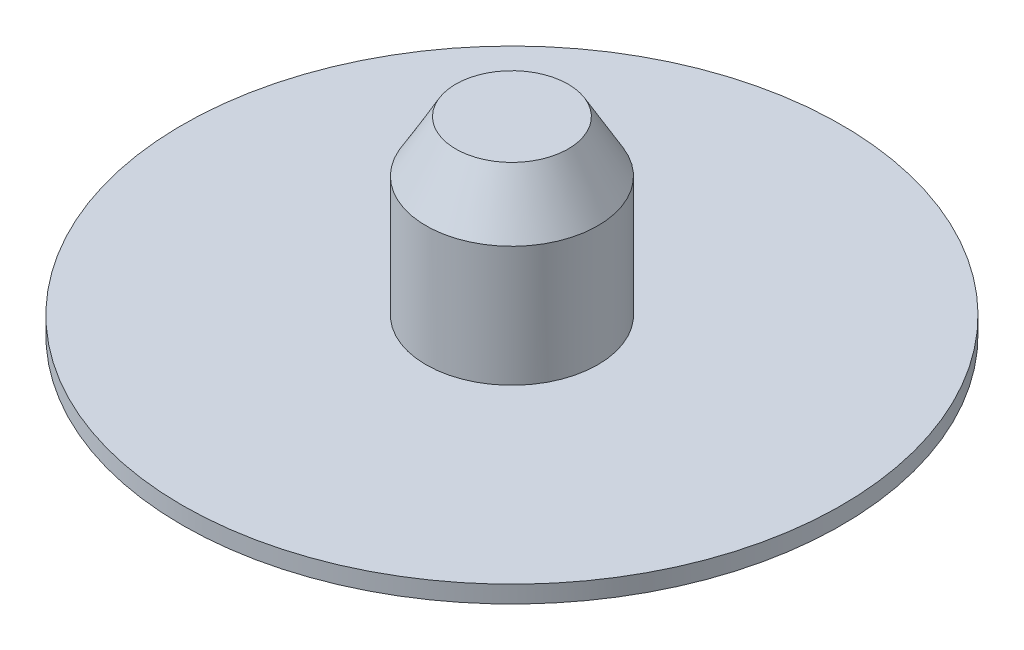
ISO-10303-21;
HEADER;
FILE_DESCRIPTION(('STEP AP214'),'2;1');
FILE_NAME('part.step','',(''),(''),'','','');
FILE_SCHEMA(('AUTOMOTIVE_DESIGN { 1 0 10303 214 1 1 1 1 }'));
ENDSEC;
DATA;
#1=APPLICATION_CONTEXT('core data for automotive mechanical design processes');
#2=APPLICATION_PROTOCOL_DEFINITION('international standard','automotive_design',2000,#1);
#3=PRODUCT_CONTEXT('',#1,'mechanical');
#4=PRODUCT('Part','Part','',(#3));
#5=PRODUCT_RELATED_PRODUCT_CATEGORY('part','',(#4));
#6=PRODUCT_DEFINITION_FORMATION('','',#4);
#7=PRODUCT_DEFINITION_CONTEXT('part definition',#1,'design');
#8=PRODUCT_DEFINITION('design','',#6,#7);
#9=PRODUCT_DEFINITION_SHAPE('','',#8);
#10=(LENGTH_UNIT() NAMED_UNIT(*) SI_UNIT(.MILLI.,.METRE.));
#11=(NAMED_UNIT(*) PLANE_ANGLE_UNIT() SI_UNIT($,.RADIAN.));
#12=(NAMED_UNIT(*) SI_UNIT($,.STERADIAN.) SOLID_ANGLE_UNIT());
#13=UNCERTAINTY_MEASURE_WITH_UNIT(LENGTH_MEASURE(1.E-05),#10,'distance_accuracy_value','');
#14=(GEOMETRIC_REPRESENTATION_CONTEXT(3) GLOBAL_UNCERTAINTY_ASSIGNED_CONTEXT((#13)) GLOBAL_UNIT_ASSIGNED_CONTEXT((#10,
#11,#12)) REPRESENTATION_CONTEXT('',''));
#15=CARTESIAN_POINT('',(0.,0.,0.));
#16=DIRECTION('',(0.,0.,1.));
#17=DIRECTION('',(1.,0.,0.));
#18=AXIS2_PLACEMENT_3D('',#15,#16,#17);
#19=CARTESIAN_POINT('',(0.,0.3,0.));
#20=DIRECTION('',(0.,-1.,0.));
#21=DIRECTION('',(0.,0.,-1.));
#22=AXIS2_PLACEMENT_3D('',#19,#20,#21);
#23=CYLINDRICAL_SURFACE('',#22,5.75);
#24=CARTESIAN_POINT('',(0.,0.3,0.));
#25=DIRECTION('',(0.,1.,0.));
#26=DIRECTION('',(0.,0.,1.));
#27=AXIS2_PLACEMENT_3D('',#24,#25,#26);
#28=CIRCLE('',#27,5.75);
#29=CARTESIAN_POINT('',(0.,0.3,5.75));
#30=VERTEX_POINT('',#29);
#31=EDGE_CURVE('E48',#30,#30,#28,.T.);
#32=ORIENTED_EDGE('',*,*,#31,.F.);
#33=EDGE_LOOP('',(#32));
#34=FACE_BOUND('',#33,.T.);
#35=CARTESIAN_POINT('',(0.,0.,0.));
#36=DIRECTION('',(0.,1.,0.));
#37=DIRECTION('',(0.,0.,1.));
#38=AXIS2_PLACEMENT_3D('',#35,#36,#37);
#39=CIRCLE('',#38,5.75);
#40=CARTESIAN_POINT('',(0.,0.,5.75));
#41=VERTEX_POINT('',#40);
#42=EDGE_CURVE('E51',#41,#41,#39,.T.);
#43=ORIENTED_EDGE('',*,*,#42,.T.);
#44=EDGE_LOOP('',(#43));
#45=FACE_BOUND('',#44,.T.);
#46=ADVANCED_FACE('F32',(#34,#45),#23,.T.);
#47=CARTESIAN_POINT('',(0.,0.3,0.));
#48=DIRECTION('',(0.,1.,0.));
#49=DIRECTION('',(0.,0.,1.));
#50=AXIS2_PLACEMENT_3D('',#47,#48,#49);
#51=PLANE('',#50);
#52=CARTESIAN_POINT('',(0.,0.3,0.));
#53=DIRECTION('',(0.,1.,0.));
#54=DIRECTION('',(0.,0.,1.));
#55=AXIS2_PLACEMENT_3D('',#52,#53,#54);
#56=CIRCLE('',#55,1.5);
#57=CARTESIAN_POINT('',(0.,0.3,1.5));
#58=VERTEX_POINT('',#57);
#59=EDGE_CURVE('E44',#58,#58,#56,.T.);
#60=ORIENTED_EDGE('',*,*,#59,.F.);
#61=EDGE_LOOP('',(#60));
#62=FACE_BOUND('',#61,.T.);
#63=ORIENTED_EDGE('',*,*,#31,.T.);
#64=EDGE_LOOP('',(#63));
#65=FACE_BOUND('',#64,.T.);
#66=ADVANCED_FACE('F57',(#62,#65),#51,.T.);
#67=CARTESIAN_POINT('',(0.,0.,0.));
#68=DIRECTION('',(0.,1.,0.));
#69=DIRECTION('',(0.,0.,1.));
#70=AXIS2_PLACEMENT_3D('',#67,#68,#69);
#71=PLANE('',#70);
#72=ORIENTED_EDGE('',*,*,#42,.F.);
#73=EDGE_LOOP('',(#72));
#74=FACE_BOUND('',#73,.T.);
#75=ADVANCED_FACE('F63',(#74),#71,.F.);
#76=CARTESIAN_POINT('',(0.,3.3,0.));
#77=DIRECTION('',(0.,-1.,0.));
#78=DIRECTION('',(0.,0.,-1.));
#79=AXIS2_PLACEMENT_3D('',#76,#77,#78);
#80=CYLINDRICAL_SURFACE('',#79,1.5);
#81=CARTESIAN_POINT('',(0.,2.39999999999999,0.));
#82=DIRECTION('',(0.,1.,0.));
#83=DIRECTION('',(0.,0.,1.));
#84=AXIS2_PLACEMENT_3D('',#81,#82,#83);
#85=CIRCLE('',#84,1.5);
#86=CARTESIAN_POINT('',(0.,2.39999999999999,-1.5));
#87=VERTEX_POINT('',#86);
#88=EDGE_CURVE('E10',#87,#87,#85,.F.);
#89=ORIENTED_EDGE('',*,*,#88,.T.);
#90=EDGE_LOOP('',(#89));
#91=FACE_BOUND('',#90,.T.);
#92=ORIENTED_EDGE('',*,*,#59,.T.);
#93=EDGE_LOOP('',(#92));
#94=FACE_BOUND('',#93,.T.);
#95=ADVANCED_FACE('F65',(#91,#94),#80,.T.);
#96=CARTESIAN_POINT('',(0.,3.3,0.));
#97=DIRECTION('',(0.,1.,0.));
#98=DIRECTION('',(0.,0.,1.));
#99=AXIS2_PLACEMENT_3D('',#96,#97,#98);
#100=PLANE('',#99);
#101=CARTESIAN_POINT('',(0.,3.3,0.));
#102=DIRECTION('',(0.,1.,0.));
#103=DIRECTION('',(0.,0.,1.));
#104=AXIS2_PLACEMENT_3D('',#101,#102,#103);
#105=CIRCLE('',#104,0.980384757729335);
#106=CARTESIAN_POINT('',(0.,3.3,-0.980384757729335));
#107=VERTEX_POINT('',#106);
#108=EDGE_CURVE('E40',#107,#107,#105,.T.);
#109=ORIENTED_EDGE('',*,*,#108,.T.);
#110=EDGE_LOOP('',(#109));
#111=FACE_BOUND('',#110,.T.);
#112=ADVANCED_FACE('F71',(#111),#100,.T.);
#113=CARTESIAN_POINT('',(0.,3.3,0.));
#114=DIRECTION('',(0.,-1.,0.));
#115=DIRECTION('',(0.,0.,-1.));
#116=AXIS2_PLACEMENT_3D('',#113,#114,#115);
#117=CONICAL_SURFACE('',#116,0.980384757729335,0.523598775598297);
#118=CARTESIAN_POINT('',(0.,2.39999999999999,-1.5));
#119=CARTESIAN_POINT('',(0.,2.40937499999999,-1.49458734122635));
#120=CARTESIAN_POINT('',(0.,2.41874999999999,-1.48917468245269));
#121=CARTESIAN_POINT('',(0.,2.43749999999999,-1.47834936490539));
#122=CARTESIAN_POINT('',(0.,2.44687499999999,-1.47293670613174));
#123=CARTESIAN_POINT('',(0.,2.46562499999999,-1.46211138858443));
#124=CARTESIAN_POINT('',(0.,2.47499999999999,-1.45669872981078));
#125=CARTESIAN_POINT('',(0.,2.49374999999999,-1.44587341226347));
#126=CARTESIAN_POINT('',(0.,2.50312499999999,-1.44046075348982));
#127=CARTESIAN_POINT('',(0.,2.52187499999999,-1.42963543594251));
#128=CARTESIAN_POINT('',(0.,2.53124999999999,-1.42422277716886));
#129=CARTESIAN_POINT('',(0.,2.54999999999999,-1.41339745962156));
#130=CARTESIAN_POINT('',(0.,2.55937499999999,-1.4079848008479));
#131=CARTESIAN_POINT('',(0.,2.57812499999999,-1.3971594833006));
#132=CARTESIAN_POINT('',(0.,2.58749999999999,-1.39174682452694));
#133=CARTESIAN_POINT('',(0.,2.60624999999999,-1.38092150697964));
#134=CARTESIAN_POINT('',(0.,2.61562499999999,-1.37550884820599));
#135=CARTESIAN_POINT('',(0.,2.63437499999999,-1.36468353065868));
#136=CARTESIAN_POINT('',(0.,2.64374999999999,-1.35927087188503));
#137=CARTESIAN_POINT('',(0.,2.66249999999999,-1.34844555433772));
#138=CARTESIAN_POINT('',(0.,2.671875,-1.34303289556407));
#139=CARTESIAN_POINT('',(0.,2.69062499999999,-1.33220757801676));
#140=CARTESIAN_POINT('',(0.,2.69999999999999,-1.32679491924311));
#141=CARTESIAN_POINT('',(0.,2.71875,-1.31596960169581));
#142=CARTESIAN_POINT('',(0.,2.728125,-1.31055694292215));
#143=CARTESIAN_POINT('',(0.,2.746875,-1.29973162537485));
#144=CARTESIAN_POINT('',(0.,2.75625,-1.2943189666012));
#145=CARTESIAN_POINT('',(0.,2.775,-1.28349364905389));
#146=CARTESIAN_POINT('',(0.,2.784375,-1.27808099028024));
#147=CARTESIAN_POINT('',(0.,2.803125,-1.26725567273293));
#148=CARTESIAN_POINT('',(0.,2.8125,-1.26184301395928));
#149=CARTESIAN_POINT('',(0.,2.83125,-1.25101769641197));
#150=CARTESIAN_POINT('',(0.,2.840625,-1.24560503763832));
#151=CARTESIAN_POINT('',(0.,2.859375,-1.23477972009101));
#152=CARTESIAN_POINT('',(0.,2.86875,-1.22936706131736));
#153=CARTESIAN_POINT('',(0.,2.8875,-1.21854174377006));
#154=CARTESIAN_POINT('',(0.,2.896875,-1.2131290849964));
#155=CARTESIAN_POINT('',(0.,2.915625,-1.2023037674491));
#156=CARTESIAN_POINT('',(0.,2.925,-1.19689110867545));
#157=CARTESIAN_POINT('',(0.,2.94375,-1.18606579112814));
#158=CARTESIAN_POINT('',(0.,2.953125,-1.18065313235449));
#159=CARTESIAN_POINT('',(0.,2.971875,-1.16982781480718));
#160=CARTESIAN_POINT('',(0.,2.98125,-1.16441515603353));
#161=CARTESIAN_POINT('',(0.,3.,-1.15358983848622));
#162=CARTESIAN_POINT('',(0.,3.009375,-1.14817717971257));
#163=CARTESIAN_POINT('',(0.,3.028125,-1.13735186216527));
#164=CARTESIAN_POINT('',(0.,3.0375,-1.13193920339161));
#165=CARTESIAN_POINT('',(0.,3.05625,-1.12111388584431));
#166=CARTESIAN_POINT('',(0.,3.065625,-1.11570122707065));
#167=CARTESIAN_POINT('',(0.,3.084375,-1.10487590952335));
#168=CARTESIAN_POINT('',(0.,3.09375,-1.0994632507497));
#169=CARTESIAN_POINT('',(0.,3.1125,-1.08863793320239));
#170=CARTESIAN_POINT('',(0.,3.121875,-1.08322527442874));
#171=CARTESIAN_POINT('',(0.,3.140625,-1.07239995688143));
#172=CARTESIAN_POINT('',(0.,3.15,-1.06698729810778));
#173=CARTESIAN_POINT('',(0.,3.16875,-1.05616198056047));
#174=CARTESIAN_POINT('',(0.,3.178125,-1.05074932178682));
#175=CARTESIAN_POINT('',(0.,3.196875,-1.03992400423952));
#176=CARTESIAN_POINT('',(0.,3.20625,-1.03451134546586));
#177=CARTESIAN_POINT('',(0.,3.225,-1.02368602791856));
#178=CARTESIAN_POINT('',(0.,3.234375,-1.0182733691449));
#179=CARTESIAN_POINT('',(0.,3.253125,-1.0074480515976));
#180=CARTESIAN_POINT('',(0.,3.2625,-1.00203539282395));
#181=CARTESIAN_POINT('',(0.,3.28125,-0.991210075276641));
#182=CARTESIAN_POINT('',(0.,3.290625,-0.985797416502988));
#183=CARTESIAN_POINT('',(0.,3.3,-0.980384757729335));
#184=B_SPLINE_CURVE_WITH_KNOTS('',3,(#118,#119,#120,#121,#122,#123,#124,#125,#126,#127,#128,
#129,#130,#131,#132,#133,#134,#135,#136,#137,#138,#139,#140,#141,#142,#143,#144,#145,#146,#147,
#148,#149,#150,#151,#152,#153,#154,#155,#156,#157,#158,#159,#160,#161,#162,#163,#164,#165,#166,
#167,#168,#169,#170,#171,#172,#173,#174,#175,#176,#177,#178,#179,#180,#181,#182,#183),
.UNSPECIFIED.,.F.,.F.,(4,2,2,2,2,2,2,2,2,2,2,2,2,2,2,2,2,2,2,2,2,2,2,2,2,2,2,2,2,2,2,2,4),(0.,
0.0324759526419165,0.0649519052838333,0.0974278579257501,0.129903810567667,0.162379763209583,
0.1948557158515,0.227331668493417,0.259807621135333,0.29228357377725,0.324759526419167,
0.357235479061083,0.389711431703,0.422187384344917,0.454663336986833,0.48713928962875,
0.519615242270667,0.552091194912583,0.5845671475545,0.617043100196417,0.649519052838333,
0.68199500548025,0.714470958122167,0.746946910764083,0.779422863406,0.811898816047917,
0.844374768689834,0.87685072133175,0.909326673973667,0.941802626615584,0.9742785792575,
1.00675453189942,1.03923048454133),.UNSPECIFIED.);
#185=EDGE_CURVE('BSEAM35',#87,#107,#184,.T.);
#186=ORIENTED_EDGE('',*,*,#88,.F.);
#187=ORIENTED_EDGE('',*,*,#108,.F.);
#188=ORIENTED_EDGE('',*,*,#185,.T.);
#189=ORIENTED_EDGE('',*,*,#185,.F.);
#190=EDGE_LOOP('',(#186,#188,#187,#189));
#191=FACE_BOUND('',#190,.T.);
#192=ADVANCED_FACE('F35',(#191),#117,.T.);
#193=CLOSED_SHELL('',(#46,#66,#75,#95,#112,#192));
#194=MANIFOLD_SOLID_BREP('B2',#193);
#195=ADVANCED_BREP_SHAPE_REPRESENTATION('',(#18,#194),#14);
#196=SHAPE_DEFINITION_REPRESENTATION(#9,#195);
ENDSEC;
END-ISO-10303-21;
